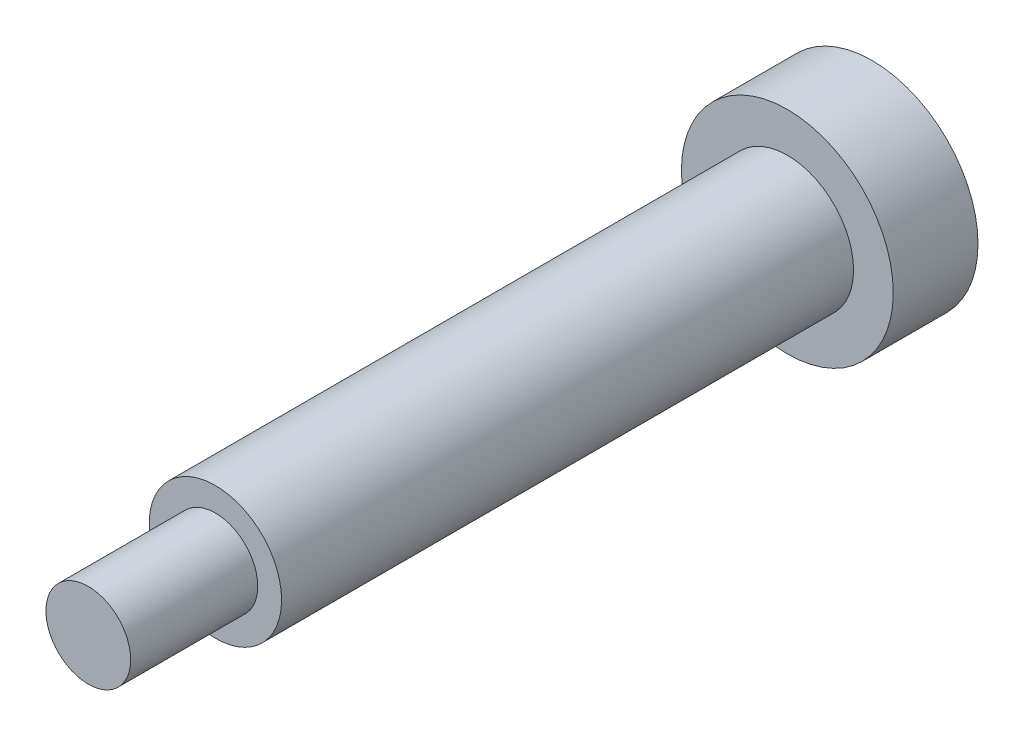
ISO-10303-21;
HEADER;
FILE_DESCRIPTION(('STEP AP214'),'2;1');
FILE_NAME('part.step','',(''),(''),'','','');
FILE_SCHEMA(('AUTOMOTIVE_DESIGN { 1 0 10303 214 1 1 1 1 }'));
ENDSEC;
DATA;
#1=APPLICATION_CONTEXT('core data for automotive mechanical design processes');
#2=APPLICATION_PROTOCOL_DEFINITION('international standard','automotive_design',2000,#1);
#3=PRODUCT_CONTEXT('',#1,'mechanical');
#4=PRODUCT('Part','Part','',(#3));
#5=PRODUCT_RELATED_PRODUCT_CATEGORY('part','',(#4));
#6=PRODUCT_DEFINITION_FORMATION('','',#4);
#7=PRODUCT_DEFINITION_CONTEXT('part definition',#1,'design');
#8=PRODUCT_DEFINITION('design','',#6,#7);
#9=PRODUCT_DEFINITION_SHAPE('','',#8);
#10=(LENGTH_UNIT() NAMED_UNIT(*) SI_UNIT(.MILLI.,.METRE.));
#11=(NAMED_UNIT(*) PLANE_ANGLE_UNIT() SI_UNIT($,.RADIAN.));
#12=(NAMED_UNIT(*) SI_UNIT($,.STERADIAN.) SOLID_ANGLE_UNIT());
#13=UNCERTAINTY_MEASURE_WITH_UNIT(LENGTH_MEASURE(1.E-05),#10,'distance_accuracy_value','');
#14=(GEOMETRIC_REPRESENTATION_CONTEXT(3) GLOBAL_UNCERTAINTY_ASSIGNED_CONTEXT((#13)) GLOBAL_UNIT_ASSIGNED_CONTEXT((#10,
#11,#12)) REPRESENTATION_CONTEXT('',''));
#15=CARTESIAN_POINT('',(0.,0.,0.));
#16=DIRECTION('',(0.,0.,1.));
#17=DIRECTION('',(1.,0.,0.));
#18=AXIS2_PLACEMENT_3D('',#15,#16,#17);
#19=CARTESIAN_POINT('',(0.,0.,4.));
#20=DIRECTION('',(0.,0.,-1.));
#21=DIRECTION('',(-1.,0.,0.));
#22=AXIS2_PLACEMENT_3D('',#19,#20,#21);
#23=CYLINDRICAL_SURFACE('',#22,5.);
#24=CARTESIAN_POINT('',(0.,0.,4.));
#25=DIRECTION('',(0.,0.,1.));
#26=DIRECTION('',(1.,0.,0.));
#27=AXIS2_PLACEMENT_3D('',#24,#25,#26);
#28=CIRCLE('',#27,5.);
#29=CARTESIAN_POINT('',(5.,0.,4.));
#30=VERTEX_POINT('',#29);
#31=EDGE_CURVE('E43',#30,#30,#28,.T.);
#32=ORIENTED_EDGE('',*,*,#31,.F.);
#33=EDGE_LOOP('',(#32));
#34=FACE_BOUND('',#33,.T.);
#35=CARTESIAN_POINT('',(0.,0.,0.));
#36=DIRECTION('',(0.,0.,1.));
#37=DIRECTION('',(1.,0.,0.));
#38=AXIS2_PLACEMENT_3D('',#35,#36,#37);
#39=CIRCLE('',#38,5.);
#40=CARTESIAN_POINT('',(5.,0.,0.));
#41=VERTEX_POINT('',#40);
#42=EDGE_CURVE('E34',#41,#41,#39,.T.);
#43=ORIENTED_EDGE('',*,*,#42,.T.);
#44=EDGE_LOOP('',(#43));
#45=FACE_BOUND('',#44,.T.);
#46=ADVANCED_FACE('F31',(#34,#45),#23,.T.);
#47=CARTESIAN_POINT('',(0.,0.,4.));
#48=DIRECTION('',(0.,0.,1.));
#49=DIRECTION('',(1.,0.,0.));
#50=AXIS2_PLACEMENT_3D('',#47,#48,#49);
#51=PLANE('',#50);
#52=CARTESIAN_POINT('',(0.,0.,4.));
#53=DIRECTION('',(0.,0.,1.));
#54=DIRECTION('',(1.,0.,0.));
#55=AXIS2_PLACEMENT_3D('',#52,#53,#54);
#56=CIRCLE('',#55,3.125);
#57=CARTESIAN_POINT('',(3.125,0.,4.));
#58=VERTEX_POINT('',#57);
#59=EDGE_CURVE('E38',#58,#58,#56,.T.);
#60=ORIENTED_EDGE('',*,*,#59,.F.);
#61=EDGE_LOOP('',(#60));
#62=FACE_BOUND('',#61,.T.);
#63=ORIENTED_EDGE('',*,*,#31,.T.);
#64=EDGE_LOOP('',(#63));
#65=FACE_BOUND('',#64,.T.);
#66=ADVANCED_FACE('F60',(#62,#65),#51,.T.);
#67=CARTESIAN_POINT('',(0.,0.,0.));
#68=DIRECTION('',(0.,0.,1.));
#69=DIRECTION('',(1.,0.,0.));
#70=AXIS2_PLACEMENT_3D('',#67,#68,#69);
#71=PLANE('',#70);
#72=ORIENTED_EDGE('',*,*,#42,.F.);
#73=EDGE_LOOP('',(#72));
#74=FACE_BOUND('',#73,.T.);
#75=ADVANCED_FACE('F57',(#74),#71,.F.);
#76=CARTESIAN_POINT('',(0.,0.,31.));
#77=DIRECTION('',(0.,0.,-1.));
#78=DIRECTION('',(-1.,0.,0.));
#79=AXIS2_PLACEMENT_3D('',#76,#77,#78);
#80=CYLINDRICAL_SURFACE('',#79,3.125);
#81=CARTESIAN_POINT('',(0.,0.,31.));
#82=DIRECTION('',(0.,0.,1.));
#83=DIRECTION('',(1.,0.,0.));
#84=AXIS2_PLACEMENT_3D('',#81,#82,#83);
#85=CIRCLE('',#84,3.125);
#86=CARTESIAN_POINT('',(3.125,0.,31.));
#87=VERTEX_POINT('',#86);
#88=EDGE_CURVE('E48',#87,#87,#85,.T.);
#89=ORIENTED_EDGE('',*,*,#88,.F.);
#90=EDGE_LOOP('',(#89));
#91=FACE_BOUND('',#90,.T.);
#92=ORIENTED_EDGE('',*,*,#59,.T.);
#93=EDGE_LOOP('',(#92));
#94=FACE_BOUND('',#93,.T.);
#95=ADVANCED_FACE('F59',(#91,#94),#80,.T.);
#96=CARTESIAN_POINT('',(0.,0.,31.));
#97=DIRECTION('',(0.,0.,1.));
#98=DIRECTION('',(1.,0.,0.));
#99=AXIS2_PLACEMENT_3D('',#96,#97,#98);
#100=PLANE('',#99);
#101=CARTESIAN_POINT('',(0.,0.,31.));
#102=DIRECTION('',(0.,0.,1.));
#103=DIRECTION('',(1.,0.,0.));
#104=AXIS2_PLACEMENT_3D('',#101,#102,#103);
#105=CIRCLE('',#104,2.);
#106=CARTESIAN_POINT('',(2.,0.,31.));
#107=VERTEX_POINT('',#106);
#108=EDGE_CURVE('E10',#107,#107,#105,.T.);
#109=ORIENTED_EDGE('',*,*,#108,.F.);
#110=EDGE_LOOP('',(#109));
#111=FACE_BOUND('',#110,.T.);
#112=ORIENTED_EDGE('',*,*,#88,.T.);
#113=EDGE_LOOP('',(#112));
#114=FACE_BOUND('',#113,.T.);
#115=ADVANCED_FACE('F65',(#111,#114),#100,.T.);
#116=CARTESIAN_POINT('',(0.,0.,37.));
#117=DIRECTION('',(0.,0.,-1.));
#118=DIRECTION('',(-1.,0.,0.));
#119=AXIS2_PLACEMENT_3D('',#116,#117,#118);
#120=CYLINDRICAL_SURFACE('',#119,2.);
#121=CARTESIAN_POINT('',(0.,0.,37.));
#122=DIRECTION('',(0.,0.,1.));
#123=DIRECTION('',(1.,0.,0.));
#124=AXIS2_PLACEMENT_3D('',#121,#122,#123);
#125=CIRCLE('',#124,2.);
#126=CARTESIAN_POINT('',(2.,0.,37.));
#127=VERTEX_POINT('',#126);
#128=EDGE_CURVE('E47',#127,#127,#125,.T.);
#129=ORIENTED_EDGE('',*,*,#128,.F.);
#130=EDGE_LOOP('',(#129));
#131=FACE_BOUND('',#130,.T.);
#132=ORIENTED_EDGE('',*,*,#108,.T.);
#133=EDGE_LOOP('',(#132));
#134=FACE_BOUND('',#133,.T.);
#135=ADVANCED_FACE('F95',(#131,#134),#120,.T.);
#136=CARTESIAN_POINT('',(0.,0.,37.));
#137=DIRECTION('',(0.,0.,1.));
#138=DIRECTION('',(1.,0.,0.));
#139=AXIS2_PLACEMENT_3D('',#136,#137,#138);
#140=PLANE('',#139);
#141=ORIENTED_EDGE('',*,*,#128,.T.);
#142=EDGE_LOOP('',(#141));
#143=FACE_BOUND('',#142,.T.);
#144=ADVANCED_FACE('F105',(#143),#140,.T.);
#145=CLOSED_SHELL('',(#46,#66,#75,#95,#115,#135,#144));
#146=MANIFOLD_SOLID_BREP('B2',#145);
#147=ADVANCED_BREP_SHAPE_REPRESENTATION('',(#18,#146),#14);
#148=SHAPE_DEFINITION_REPRESENTATION(#9,#147);
ENDSEC;
END-ISO-10303-21;
